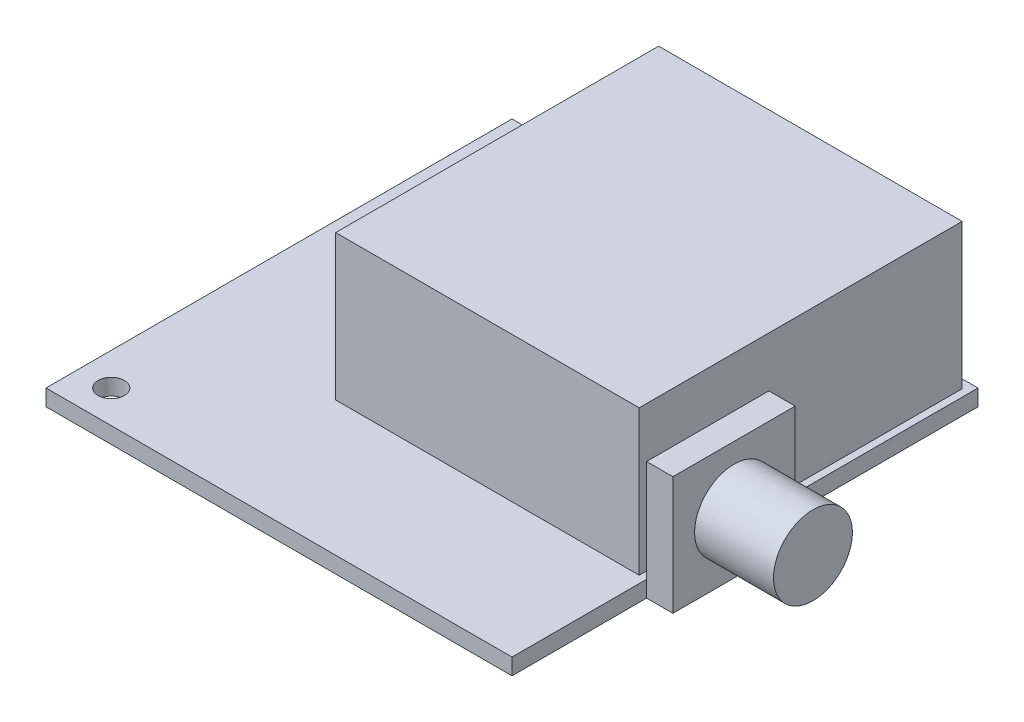
ISO-10303-21;
HEADER;
FILE_DESCRIPTION(('STEP AP214'),'2;1');
FILE_NAME('part.step','',(''),(''),'','','');
FILE_SCHEMA(('AUTOMOTIVE_DESIGN { 1 0 10303 214 1 1 1 1 }'));
ENDSEC;
DATA;
#1=APPLICATION_CONTEXT('core data for automotive mechanical design processes');
#2=APPLICATION_PROTOCOL_DEFINITION('international standard','automotive_design',2000,#1);
#3=PRODUCT_CONTEXT('',#1,'mechanical');
#4=PRODUCT('Part','Part','',(#3));
#5=PRODUCT_RELATED_PRODUCT_CATEGORY('part','',(#4));
#6=PRODUCT_DEFINITION_FORMATION('','',#4);
#7=PRODUCT_DEFINITION_CONTEXT('part definition',#1,'design');
#8=PRODUCT_DEFINITION('design','',#6,#7);
#9=PRODUCT_DEFINITION_SHAPE('','',#8);
#10=(LENGTH_UNIT() NAMED_UNIT(*) SI_UNIT(.MILLI.,.METRE.));
#11=(NAMED_UNIT(*) PLANE_ANGLE_UNIT() SI_UNIT($,.RADIAN.));
#12=(NAMED_UNIT(*) SI_UNIT($,.STERADIAN.) SOLID_ANGLE_UNIT());
#13=UNCERTAINTY_MEASURE_WITH_UNIT(LENGTH_MEASURE(1.E-05),#10,'distance_accuracy_value','');
#14=(GEOMETRIC_REPRESENTATION_CONTEXT(3) GLOBAL_UNCERTAINTY_ASSIGNED_CONTEXT((#13)) GLOBAL_UNIT_ASSIGNED_CONTEXT((#10,
#11,#12)) REPRESENTATION_CONTEXT('',''));
#15=CARTESIAN_POINT('',(0.,0.,0.));
#16=DIRECTION('',(0.,0.,1.));
#17=DIRECTION('',(1.,0.,0.));
#18=AXIS2_PLACEMENT_3D('',#15,#16,#17);
#19=CARTESIAN_POINT('',(22.5,1.5748,-22.5));
#20=DIRECTION('',(-1.,0.,0.));
#21=DIRECTION('',(0.,0.,1.));
#22=AXIS2_PLACEMENT_3D('',#19,#20,#21);
#23=PLANE('',#22);
#24=DIRECTION('',(0.,-1.,0.));
#25=VECTOR('',#24,1.);
#26=CARTESIAN_POINT('',(22.5,0.,9.50307411646456));
#27=LINE('',#26,#25);
#28=CARTESIAN_POINT('',(22.5,1.5748,9.50307411646455));
#29=VERTEX_POINT('',#28);
#30=CARTESIAN_POINT('',(22.5,0.,9.50307411646455));
#31=VERTEX_POINT('',#30);
#32=EDGE_CURVE('E49',#29,#31,#27,.T.);
#33=ORIENTED_EDGE('',*,*,#32,.F.);
#34=DIRECTION('',(0.,0.,-1.));
#35=VECTOR('',#34,1.);
#36=CARTESIAN_POINT('',(22.5,1.5748,-22.5));
#37=LINE('',#36,#35);
#38=CARTESIAN_POINT('',(22.5,1.5748,22.5));
#39=VERTEX_POINT('',#38);
#40=EDGE_CURVE('E242',#39,#29,#37,.T.);
#41=ORIENTED_EDGE('',*,*,#40,.F.);
#42=DIRECTION('',(0.,-1.,0.));
#43=VECTOR('',#42,1.);
#44=CARTESIAN_POINT('',(22.5,1.5748,22.5));
#45=LINE('',#44,#43);
#46=CARTESIAN_POINT('',(22.5,0.,22.5));
#47=VERTEX_POINT('',#46);
#48=EDGE_CURVE('E265',#39,#47,#45,.T.);
#49=ORIENTED_EDGE('',*,*,#48,.T.);
#50=DIRECTION('',(0.,0.,-1.));
#51=VECTOR('',#50,1.);
#52=CARTESIAN_POINT('',(22.5,0.,-22.5));
#53=LINE('',#52,#51);
#54=EDGE_CURVE('E255',#47,#31,#53,.T.);
#55=ORIENTED_EDGE('',*,*,#54,.T.);
#56=EDGE_LOOP('',(#33,#41,#49,#55));
#57=FACE_BOUND('',#56,.T.);
#58=ADVANCED_FACE('F40',(#57),#23,.F.);
#59=DIRECTION('',(0.,1.,0.));
#60=VECTOR('',#59,1.);
#61=CARTESIAN_POINT('',(22.5,0.,-2.30630944028398));
#62=LINE('',#61,#60);
#63=CARTESIAN_POINT('',(22.5,0.,-2.30630944028399));
#64=VERTEX_POINT('',#63);
#65=CARTESIAN_POINT('',(22.5,1.5748,-2.30630944028398));
#66=VERTEX_POINT('',#65);
#67=EDGE_CURVE('E66',#64,#66,#62,.T.);
#68=ORIENTED_EDGE('',*,*,#67,.F.);
#69=CARTESIAN_POINT('',(22.5,0.,-22.5));
#70=VERTEX_POINT('',#69);
#71=EDGE_CURVE('E254',#64,#70,#53,.T.);
#72=ORIENTED_EDGE('',*,*,#71,.T.);
#73=DIRECTION('',(0.,-1.,0.));
#74=VECTOR('',#73,1.);
#75=CARTESIAN_POINT('',(22.5,1.5748,-22.5));
#76=LINE('',#75,#74);
#77=CARTESIAN_POINT('',(22.5,1.5748,-22.5));
#78=VERTEX_POINT('',#77);
#79=EDGE_CURVE('E261',#78,#70,#76,.T.);
#80=ORIENTED_EDGE('',*,*,#79,.F.);
#81=EDGE_CURVE('E241',#66,#78,#37,.T.);
#82=ORIENTED_EDGE('',*,*,#81,.F.);
#83=EDGE_LOOP('',(#68,#72,#80,#82));
#84=FACE_BOUND('',#83,.T.);
#85=ADVANCED_FACE('F313',(#84),#23,.F.);
#86=CARTESIAN_POINT('',(0.,1.5748,0.));
#87=DIRECTION('',(0.,1.,0.));
#88=DIRECTION('',(0.,0.,1.));
#89=AXIS2_PLACEMENT_3D('',#86,#87,#88);
#90=PLANE('',#89);
#91=CARTESIAN_POINT('',(-19.3504,1.5748,-19.3504));
#92=DIRECTION('',(0.,1.,0.));
#93=DIRECTION('',(0.,0.,1.));
#94=AXIS2_PLACEMENT_3D('',#91,#92,#93);
#95=CIRCLE('',#94,1.27);
#96=CARTESIAN_POINT('',(-19.3504,1.5748,-18.0804));
#97=VERTEX_POINT('',#96);
#98=EDGE_CURVE('E228',#97,#97,#95,.T.);
#99=ORIENTED_EDGE('',*,*,#98,.F.);
#100=EDGE_LOOP('',(#99));
#101=FACE_BOUND('',#100,.T.);
#102=DIRECTION('',(0.,0.,1.));
#103=VECTOR('',#102,1.);
#104=CARTESIAN_POINT('',(-22.5,1.5748,-22.5));
#105=LINE('',#104,#103);
#106=CARTESIAN_POINT('',(-22.5,1.5748,-22.5));
#107=VERTEX_POINT('',#106);
#108=CARTESIAN_POINT('',(-22.5,1.5748,22.5));
#109=VERTEX_POINT('',#108);
#110=EDGE_CURVE('E234',#107,#109,#105,.T.);
#111=ORIENTED_EDGE('',*,*,#110,.T.);
#112=DIRECTION('',(1.,0.,0.));
#113=VECTOR('',#112,1.);
#114=CARTESIAN_POINT('',(-22.5,1.5748,22.5));
#115=LINE('',#114,#113);
#116=EDGE_CURVE('E238',#109,#39,#115,.T.);
#117=ORIENTED_EDGE('',*,*,#116,.T.);
#118=ORIENTED_EDGE('',*,*,#40,.T.);
#119=EDGE_CURVE('E245',#29,#66,#37,.T.);
#120=ORIENTED_EDGE('',*,*,#119,.T.);
#121=ORIENTED_EDGE('',*,*,#81,.T.);
#122=DIRECTION('',(-1.,0.,0.));
#123=VECTOR('',#122,1.);
#124=CARTESIAN_POINT('',(-22.5,1.5748,-22.5));
#125=LINE('',#124,#123);
#126=EDGE_CURVE('E244',#78,#107,#125,.T.);
#127=ORIENTED_EDGE('',*,*,#126,.T.);
#128=EDGE_LOOP('',(#111,#117,#118,#120,#121,#127));
#129=FACE_BOUND('',#128,.T.);
#130=CARTESIAN_POINT('',(-19.3504,1.5748,19.3504));
#131=DIRECTION('',(0.,1.,0.));
#132=DIRECTION('',(0.,0.,1.));
#133=AXIS2_PLACEMENT_3D('',#130,#131,#132);
#134=CIRCLE('',#133,1.27);
#135=CARTESIAN_POINT('',(-19.3504,1.5748,20.6204));
#136=VERTEX_POINT('',#135);
#137=EDGE_CURVE('E222',#136,#136,#134,.T.);
#138=ORIENTED_EDGE('',*,*,#137,.F.);
#139=EDGE_LOOP('',(#138));
#140=FACE_BOUND('',#139,.T.);
#141=DIRECTION('',(-1.,0.,0.));
#142=VECTOR('',#141,1.);
#143=CARTESIAN_POINT('',(21.7984716950691,1.5748,-21.6680980605292));
#144=LINE('',#143,#142);
#145=CARTESIAN_POINT('',(21.7984716950691,1.5748,-21.6680980605292));
#146=VERTEX_POINT('',#145);
#147=CARTESIAN_POINT('',(-7.5095213494975,1.5748,-21.6680980605292));
#148=VERTEX_POINT('',#147);
#149=EDGE_CURVE('E180',#146,#148,#144,.T.);
#150=ORIENTED_EDGE('',*,*,#149,.F.);
#151=DIRECTION('',(0.,0.,-1.));
#152=VECTOR('',#151,1.);
#153=CARTESIAN_POINT('',(21.7984716950691,1.5748,-21.6680980605292));
#154=LINE('',#153,#152);
#155=CARTESIAN_POINT('',(21.7984716950691,1.5748,9.51727532141174));
#156=VERTEX_POINT('',#155);
#157=EDGE_CURVE('E176',#156,#146,#154,.T.);
#158=ORIENTED_EDGE('',*,*,#157,.F.);
#159=DIRECTION('',(1.,0.,0.));
#160=VECTOR('',#159,1.);
#161=CARTESIAN_POINT('',(21.7984716950691,1.5748,9.51727532141174));
#162=LINE('',#161,#160);
#163=CARTESIAN_POINT('',(-7.50952134949749,1.5748,9.51727532141174));
#164=VERTEX_POINT('',#163);
#165=EDGE_CURVE('E192',#164,#156,#162,.T.);
#166=ORIENTED_EDGE('',*,*,#165,.F.);
#167=DIRECTION('',(0.,0.,1.));
#168=VECTOR('',#167,1.);
#169=CARTESIAN_POINT('',(-7.5095213494975,1.5748,-21.6680980605292));
#170=LINE('',#169,#168);
#171=EDGE_CURVE('E204',#148,#164,#170,.T.);
#172=ORIENTED_EDGE('',*,*,#171,.F.);
#173=EDGE_LOOP('',(#150,#158,#166,#172));
#174=FACE_BOUND('',#173,.T.);
#175=ADVANCED_FACE('F309',(#101,#129,#140,#174),#90,.T.);
#176=CARTESIAN_POINT('',(0.,0.,0.));
#177=DIRECTION('',(0.,1.,0.));
#178=DIRECTION('',(0.,0.,1.));
#179=AXIS2_PLACEMENT_3D('',#176,#177,#178);
#180=PLANE('',#179);
#181=DIRECTION('',(0.,0.,1.));
#182=VECTOR('',#181,1.);
#183=CARTESIAN_POINT('',(-22.5,0.,-22.5));
#184=LINE('',#183,#182);
#185=CARTESIAN_POINT('',(-22.5,0.,-22.5));
#186=VERTEX_POINT('',#185);
#187=CARTESIAN_POINT('',(-22.5,0.,22.5));
#188=VERTEX_POINT('',#187);
#189=EDGE_CURVE('E231',#186,#188,#184,.T.);
#190=ORIENTED_EDGE('',*,*,#189,.F.);
#191=DIRECTION('',(-1.,0.,0.));
#192=VECTOR('',#191,1.);
#193=CARTESIAN_POINT('',(-22.5,0.,-22.5));
#194=LINE('',#193,#192);
#195=EDGE_CURVE('E239',#70,#186,#194,.T.);
#196=ORIENTED_EDGE('',*,*,#195,.F.);
#197=ORIENTED_EDGE('',*,*,#71,.F.);
#198=DIRECTION('',(-1.,0.,0.));
#199=VECTOR('',#198,1.);
#200=CARTESIAN_POINT('',(25.04,0.,-2.30630944028398));
#201=LINE('',#200,#199);
#202=CARTESIAN_POINT('',(25.04,0.,-2.30630944028398));
#203=VERTEX_POINT('',#202);
#204=EDGE_CURVE('E157',#203,#64,#201,.T.);
#205=ORIENTED_EDGE('',*,*,#204,.F.);
#206=DIRECTION('',(0.,0.,-1.));
#207=VECTOR('',#206,1.);
#208=CARTESIAN_POINT('',(25.04,0.,9.50307411646456));
#209=LINE('',#208,#207);
#210=CARTESIAN_POINT('',(25.04,0.,9.50307411646456));
#211=VERTEX_POINT('',#210);
#212=EDGE_CURVE('E148',#211,#203,#209,.T.);
#213=ORIENTED_EDGE('',*,*,#212,.F.);
#214=DIRECTION('',(-1.,0.,0.));
#215=VECTOR('',#214,1.);
#216=CARTESIAN_POINT('',(25.04,0.,9.50307411646456));
#217=LINE('',#216,#215);
#218=EDGE_CURVE('E155',#211,#31,#217,.T.);
#219=ORIENTED_EDGE('',*,*,#218,.T.);
#220=ORIENTED_EDGE('',*,*,#54,.F.);
#221=DIRECTION('',(1.,0.,0.));
#222=VECTOR('',#221,1.);
#223=CARTESIAN_POINT('',(-22.5,0.,22.5));
#224=LINE('',#223,#222);
#225=EDGE_CURVE('E252',#188,#47,#224,.T.);
#226=ORIENTED_EDGE('',*,*,#225,.F.);
#227=EDGE_LOOP('',(#190,#196,#197,#205,#213,#219,#220,#226));
#228=FACE_BOUND('',#227,.T.);
#229=CARTESIAN_POINT('',(-19.3504,0.,-19.3504));
#230=DIRECTION('',(0.,1.,0.));
#231=DIRECTION('',(0.,0.,1.));
#232=AXIS2_PLACEMENT_3D('',#229,#230,#231);
#233=CIRCLE('',#232,1.27);
#234=CARTESIAN_POINT('',(-19.3504,0.,-18.0804));
#235=VERTEX_POINT('',#234);
#236=EDGE_CURVE('E225',#235,#235,#233,.T.);
#237=ORIENTED_EDGE('',*,*,#236,.T.);
#238=EDGE_LOOP('',(#237));
#239=FACE_BOUND('',#238,.T.);
#240=CARTESIAN_POINT('',(-19.3504,0.,19.3504));
#241=DIRECTION('',(0.,1.,0.));
#242=DIRECTION('',(0.,0.,1.));
#243=AXIS2_PLACEMENT_3D('',#240,#241,#242);
#244=CIRCLE('',#243,1.27);
#245=CARTESIAN_POINT('',(-19.3504,0.,20.6204));
#246=VERTEX_POINT('',#245);
#247=EDGE_CURVE('E221',#246,#246,#244,.T.);
#248=ORIENTED_EDGE('',*,*,#247,.T.);
#249=EDGE_LOOP('',(#248));
#250=FACE_BOUND('',#249,.T.);
#251=ADVANCED_FACE('F151',(#228,#239,#250),#180,.F.);
#252=CARTESIAN_POINT('',(-22.5,1.5748,-22.5));
#253=DIRECTION('',(1.,0.,0.));
#254=DIRECTION('',(0.,0.,-1.));
#255=AXIS2_PLACEMENT_3D('',#252,#253,#254);
#256=PLANE('',#255);
#257=ORIENTED_EDGE('',*,*,#189,.T.);
#258=DIRECTION('',(0.,-1.,0.));
#259=VECTOR('',#258,1.);
#260=CARTESIAN_POINT('',(-22.5,1.5748,22.5));
#261=LINE('',#260,#259);
#262=EDGE_CURVE('E267',#109,#188,#261,.T.);
#263=ORIENTED_EDGE('',*,*,#262,.F.);
#264=ORIENTED_EDGE('',*,*,#110,.F.);
#265=DIRECTION('',(0.,-1.,0.));
#266=VECTOR('',#265,1.);
#267=CARTESIAN_POINT('',(-22.5,1.5748,-22.5));
#268=LINE('',#267,#266);
#269=EDGE_CURVE('E248',#107,#186,#268,.T.);
#270=ORIENTED_EDGE('',*,*,#269,.T.);
#271=EDGE_LOOP('',(#257,#263,#264,#270));
#272=FACE_BOUND('',#271,.T.);
#273=ADVANCED_FACE('F42',(#272),#256,.F.);
#274=CARTESIAN_POINT('',(-22.5,1.5748,22.5));
#275=DIRECTION('',(0.,0.,-1.));
#276=DIRECTION('',(-1.,0.,0.));
#277=AXIS2_PLACEMENT_3D('',#274,#275,#276);
#278=PLANE('',#277);
#279=ORIENTED_EDGE('',*,*,#225,.T.);
#280=ORIENTED_EDGE('',*,*,#48,.F.);
#281=ORIENTED_EDGE('',*,*,#116,.F.);
#282=ORIENTED_EDGE('',*,*,#262,.T.);
#283=EDGE_LOOP('',(#279,#280,#281,#282));
#284=FACE_BOUND('',#283,.T.);
#285=ADVANCED_FACE('F320',(#284),#278,.F.);
#286=CARTESIAN_POINT('',(-22.5,1.5748,-22.5));
#287=DIRECTION('',(0.,0.,1.));
#288=DIRECTION('',(1.,0.,0.));
#289=AXIS2_PLACEMENT_3D('',#286,#287,#288);
#290=PLANE('',#289);
#291=ORIENTED_EDGE('',*,*,#195,.T.);
#292=ORIENTED_EDGE('',*,*,#269,.F.);
#293=ORIENTED_EDGE('',*,*,#126,.F.);
#294=ORIENTED_EDGE('',*,*,#79,.T.);
#295=EDGE_LOOP('',(#291,#292,#293,#294));
#296=FACE_BOUND('',#295,.T.);
#297=ADVANCED_FACE('F316',(#296),#290,.F.);
#298=CARTESIAN_POINT('',(-19.3504,1.5748,-19.3504));
#299=DIRECTION('',(0.,-1.,0.));
#300=DIRECTION('',(0.,0.,-1.));
#301=AXIS2_PLACEMENT_3D('',#298,#299,#300);
#302=CYLINDRICAL_SURFACE('',#301,1.27);
#303=ORIENTED_EDGE('',*,*,#98,.T.);
#304=EDGE_LOOP('',(#303));
#305=FACE_BOUND('',#304,.T.);
#306=ORIENTED_EDGE('',*,*,#236,.F.);
#307=EDGE_LOOP('',(#306));
#308=FACE_BOUND('',#307,.T.);
#309=ADVANCED_FACE('F333',(#305,#308),#302,.F.);
#310=CARTESIAN_POINT('',(-19.3504,1.5748,19.3504));
#311=DIRECTION('',(0.,-1.,0.));
#312=DIRECTION('',(0.,0.,-1.));
#313=AXIS2_PLACEMENT_3D('',#310,#311,#312);
#314=CYLINDRICAL_SURFACE('',#313,1.27);
#315=ORIENTED_EDGE('',*,*,#137,.T.);
#316=EDGE_LOOP('',(#315));
#317=FACE_BOUND('',#316,.T.);
#318=ORIENTED_EDGE('',*,*,#247,.F.);
#319=EDGE_LOOP('',(#318));
#320=FACE_BOUND('',#319,.T.);
#321=ADVANCED_FACE('F345',(#317,#320),#314,.F.);
#322=CARTESIAN_POINT('',(21.7984716950691,15.5748,-21.6680980605292));
#323=DIRECTION('',(-1.,0.,0.));
#324=DIRECTION('',(0.,0.,1.));
#325=AXIS2_PLACEMENT_3D('',#322,#323,#324);
#326=PLANE('',#325);
#327=ORIENTED_EDGE('',*,*,#157,.T.);
#328=DIRECTION('',(0.,-1.,0.));
#329=VECTOR('',#328,1.);
#330=CARTESIAN_POINT('',(21.7984716950691,15.5748,-21.6680980605292));
#331=LINE('',#330,#329);
#332=CARTESIAN_POINT('',(21.7984716950691,15.5748,-21.6680980605292));
#333=VERTEX_POINT('',#332);
#334=EDGE_CURVE('E218',#333,#146,#331,.T.);
#335=ORIENTED_EDGE('',*,*,#334,.F.);
#336=DIRECTION('',(0.,0.,-1.));
#337=VECTOR('',#336,1.);
#338=CARTESIAN_POINT('',(21.7984716950691,15.5748,-21.6680980605292));
#339=LINE('',#338,#337);
#340=CARTESIAN_POINT('',(21.7984716950691,15.5748,9.51727532141174));
#341=VERTEX_POINT('',#340);
#342=EDGE_CURVE('E187',#341,#333,#339,.T.);
#343=ORIENTED_EDGE('',*,*,#342,.F.);
#344=DIRECTION('',(0.,-1.,0.));
#345=VECTOR('',#344,1.);
#346=CARTESIAN_POINT('',(21.7984716950691,15.5748,9.51727532141174));
#347=LINE('',#346,#345);
#348=EDGE_CURVE('E200',#341,#156,#347,.T.);
#349=ORIENTED_EDGE('',*,*,#348,.T.);
#350=EDGE_LOOP('',(#327,#335,#343,#349));
#351=FACE_BOUND('',#350,.T.);
#352=ADVANCED_FACE('F349',(#351),#326,.F.);
#353=CARTESIAN_POINT('',(21.7984716950691,15.5748,-21.6680980605292));
#354=DIRECTION('',(0.,0.,1.));
#355=DIRECTION('',(1.,0.,0.));
#356=AXIS2_PLACEMENT_3D('',#353,#354,#355);
#357=PLANE('',#356);
#358=ORIENTED_EDGE('',*,*,#149,.T.);
#359=DIRECTION('',(0.,-1.,0.));
#360=VECTOR('',#359,1.);
#361=CARTESIAN_POINT('',(-7.5095213494975,15.5748,-21.6680980605292));
#362=LINE('',#361,#360);
#363=CARTESIAN_POINT('',(-7.5095213494975,15.5748,-21.6680980605292));
#364=VERTEX_POINT('',#363);
#365=EDGE_CURVE('E215',#364,#148,#362,.T.);
#366=ORIENTED_EDGE('',*,*,#365,.F.);
#367=DIRECTION('',(-1.,0.,0.));
#368=VECTOR('',#367,1.);
#369=CARTESIAN_POINT('',(21.7984716950691,15.5748,-21.6680980605292));
#370=LINE('',#369,#368);
#371=EDGE_CURVE('E191',#333,#364,#370,.T.);
#372=ORIENTED_EDGE('',*,*,#371,.F.);
#373=ORIENTED_EDGE('',*,*,#334,.T.);
#374=EDGE_LOOP('',(#358,#366,#372,#373));
#375=FACE_BOUND('',#374,.T.);
#376=ADVANCED_FACE('F353',(#375),#357,.F.);
#377=CARTESIAN_POINT('',(-7.5095213494975,15.5748,-21.6680980605292));
#378=DIRECTION('',(1.,0.,0.));
#379=DIRECTION('',(0.,0.,-1.));
#380=AXIS2_PLACEMENT_3D('',#377,#378,#379);
#381=PLANE('',#380);
#382=ORIENTED_EDGE('',*,*,#171,.T.);
#383=DIRECTION('',(0.,-1.,0.));
#384=VECTOR('',#383,1.);
#385=CARTESIAN_POINT('',(-7.50952134949749,15.5748,9.51727532141174));
#386=LINE('',#385,#384);
#387=CARTESIAN_POINT('',(-7.50952134949749,15.5748,9.51727532141174));
#388=VERTEX_POINT('',#387);
#389=EDGE_CURVE('E212',#388,#164,#386,.T.);
#390=ORIENTED_EDGE('',*,*,#389,.F.);
#391=DIRECTION('',(0.,0.,1.));
#392=VECTOR('',#391,1.);
#393=CARTESIAN_POINT('',(-7.5095213494975,15.5748,-21.6680980605292));
#394=LINE('',#393,#392);
#395=EDGE_CURVE('E195',#364,#388,#394,.T.);
#396=ORIENTED_EDGE('',*,*,#395,.F.);
#397=ORIENTED_EDGE('',*,*,#365,.T.);
#398=EDGE_LOOP('',(#382,#390,#396,#397));
#399=FACE_BOUND('',#398,.T.);
#400=ADVANCED_FACE('F357',(#399),#381,.F.);
#401=CARTESIAN_POINT('',(21.7984716950691,15.5748,9.51727532141174));
#402=DIRECTION('',(0.,0.,-1.));
#403=DIRECTION('',(-1.,0.,0.));
#404=AXIS2_PLACEMENT_3D('',#401,#402,#403);
#405=PLANE('',#404);
#406=ORIENTED_EDGE('',*,*,#165,.T.);
#407=ORIENTED_EDGE('',*,*,#348,.F.);
#408=DIRECTION('',(1.,0.,0.));
#409=VECTOR('',#408,1.);
#410=CARTESIAN_POINT('',(21.7984716950691,15.5748,9.51727532141174));
#411=LINE('',#410,#409);
#412=EDGE_CURVE('E198',#388,#341,#411,.T.);
#413=ORIENTED_EDGE('',*,*,#412,.F.);
#414=ORIENTED_EDGE('',*,*,#389,.T.);
#415=EDGE_LOOP('',(#406,#407,#413,#414));
#416=FACE_BOUND('',#415,.T.);
#417=ADVANCED_FACE('F361',(#416),#405,.F.);
#418=CARTESIAN_POINT('',(0.,15.5748,0.));
#419=DIRECTION('',(0.,-1.,0.));
#420=DIRECTION('',(0.,0.,-1.));
#421=AXIS2_PLACEMENT_3D('',#418,#419,#420);
#422=PLANE('',#421);
#423=ORIENTED_EDGE('',*,*,#342,.T.);
#424=ORIENTED_EDGE('',*,*,#371,.T.);
#425=ORIENTED_EDGE('',*,*,#395,.T.);
#426=ORIENTED_EDGE('',*,*,#412,.T.);
#427=EDGE_LOOP('',(#423,#424,#425,#426));
#428=FACE_BOUND('',#427,.T.);
#429=ADVANCED_FACE('F365',(#428),#422,.F.);
#430=CARTESIAN_POINT('',(22.5,0.,0.));
#431=DIRECTION('',(-1.,0.,0.));
#432=DIRECTION('',(0.,0.,1.));
#433=AXIS2_PLACEMENT_3D('',#430,#431,#432);
#434=PLANE('',#433);
#435=ORIENTED_EDGE('',*,*,#119,.F.);
#436=CARTESIAN_POINT('',(22.5,11.4280652418701,9.50307411646456));
#437=VERTEX_POINT('',#436);
#438=EDGE_CURVE('E272',#437,#29,#27,.T.);
#439=ORIENTED_EDGE('',*,*,#438,.F.);
#440=DIRECTION('',(0.,0.,1.));
#441=VECTOR('',#440,1.);
#442=CARTESIAN_POINT('',(22.5,11.4280652418701,9.50307411646456));
#443=LINE('',#442,#441);
#444=CARTESIAN_POINT('',(22.5,11.4280652418701,-2.30630944028398));
#445=VERTEX_POINT('',#444);
#446=EDGE_CURVE('E172',#445,#437,#443,.T.);
#447=ORIENTED_EDGE('',*,*,#446,.F.);
#448=EDGE_CURVE('E276',#66,#445,#62,.T.);
#449=ORIENTED_EDGE('',*,*,#448,.F.);
#450=EDGE_LOOP('',(#435,#439,#447,#449));
#451=FACE_BOUND('',#450,.T.);
#452=ADVANCED_FACE('F305',(#451),#434,.T.);
#453=CARTESIAN_POINT('',(25.04,0.,9.50307411646456));
#454=DIRECTION('',(0.,0.,-1.));
#455=DIRECTION('',(-1.,0.,0.));
#456=AXIS2_PLACEMENT_3D('',#453,#454,#455);
#457=PLANE('',#456);
#458=ORIENTED_EDGE('',*,*,#438,.T.);
#459=ORIENTED_EDGE('',*,*,#32,.T.);
#460=ORIENTED_EDGE('',*,*,#218,.F.);
#461=DIRECTION('',(0.,-1.,0.));
#462=VECTOR('',#461,1.);
#463=CARTESIAN_POINT('',(25.04,0.,9.50307411646456));
#464=LINE('',#463,#462);
#465=CARTESIAN_POINT('',(25.04,11.4280652418701,9.50307411646456));
#466=VERTEX_POINT('',#465);
#467=EDGE_CURVE('E162',#466,#211,#464,.T.);
#468=ORIENTED_EDGE('',*,*,#467,.F.);
#469=DIRECTION('',(-1.,0.,0.));
#470=VECTOR('',#469,1.);
#471=CARTESIAN_POINT('',(25.04,11.4280652418701,9.50307411646456));
#472=LINE('',#471,#470);
#473=EDGE_CURVE('E289',#466,#437,#472,.T.);
#474=ORIENTED_EDGE('',*,*,#473,.T.);
#475=EDGE_LOOP('',(#458,#459,#460,#468,#474));
#476=FACE_BOUND('',#475,.T.);
#477=ADVANCED_FACE('F175',(#476),#457,.F.);
#478=CARTESIAN_POINT('',(25.04,0.,-2.30630944028398));
#479=DIRECTION('',(0.,0.,1.));
#480=DIRECTION('',(1.,0.,0.));
#481=AXIS2_PLACEMENT_3D('',#478,#479,#480);
#482=PLANE('',#481);
#483=ORIENTED_EDGE('',*,*,#67,.T.);
#484=ORIENTED_EDGE('',*,*,#448,.T.);
#485=DIRECTION('',(-1.,0.,0.));
#486=VECTOR('',#485,1.);
#487=CARTESIAN_POINT('',(25.04,11.4280652418701,-2.30630944028398));
#488=LINE('',#487,#486);
#489=CARTESIAN_POINT('',(25.04,11.4280652418701,-2.30630944028398));
#490=VERTEX_POINT('',#489);
#491=EDGE_CURVE('E183',#490,#445,#488,.T.);
#492=ORIENTED_EDGE('',*,*,#491,.F.);
#493=DIRECTION('',(0.,1.,0.));
#494=VECTOR('',#493,1.);
#495=CARTESIAN_POINT('',(25.04,0.,-2.30630944028398));
#496=LINE('',#495,#494);
#497=EDGE_CURVE('E161',#203,#490,#496,.T.);
#498=ORIENTED_EDGE('',*,*,#497,.F.);
#499=ORIENTED_EDGE('',*,*,#204,.T.);
#500=EDGE_LOOP('',(#483,#484,#492,#498,#499));
#501=FACE_BOUND('',#500,.T.);
#502=ADVANCED_FACE('F297',(#501),#482,.F.);
#503=CARTESIAN_POINT('',(25.04,11.4280652418701,9.50307411646456));
#504=DIRECTION('',(0.,-1.,0.));
#505=DIRECTION('',(0.,0.,-1.));
#506=AXIS2_PLACEMENT_3D('',#503,#504,#505);
#507=PLANE('',#506);
#508=ORIENTED_EDGE('',*,*,#446,.T.);
#509=ORIENTED_EDGE('',*,*,#473,.F.);
#510=DIRECTION('',(0.,0.,1.));
#511=VECTOR('',#510,1.);
#512=CARTESIAN_POINT('',(25.04,11.4280652418701,9.50307411646456));
#513=LINE('',#512,#511);
#514=EDGE_CURVE('E167',#490,#466,#513,.T.);
#515=ORIENTED_EDGE('',*,*,#514,.F.);
#516=ORIENTED_EDGE('',*,*,#491,.T.);
#517=EDGE_LOOP('',(#508,#509,#515,#516));
#518=FACE_BOUND('',#517,.T.);
#519=ADVANCED_FACE('F302',(#518),#507,.F.);
#520=CARTESIAN_POINT('',(25.04,0.,0.));
#521=DIRECTION('',(-1.,0.,0.));
#522=DIRECTION('',(0.,0.,1.));
#523=AXIS2_PLACEMENT_3D('',#520,#521,#522);
#524=PLANE('',#523);
#525=CARTESIAN_POINT('',(25.04,5.71403262093503,3.59838233809029));
#526=DIRECTION('',(-1.,0.,0.));
#527=DIRECTION('',(0.,0.,1.));
#528=AXIS2_PLACEMENT_3D('',#525,#526,#527);
#529=CIRCLE('',#528,3.81);
#530=CARTESIAN_POINT('',(25.04,5.71403262093503,7.40838233809029));
#531=VERTEX_POINT('',#530);
#532=EDGE_CURVE('E11',#531,#531,#529,.F.);
#533=ORIENTED_EDGE('',*,*,#532,.F.);
#534=EDGE_LOOP('',(#533));
#535=FACE_BOUND('',#534,.T.);
#536=ORIENTED_EDGE('',*,*,#467,.T.);
#537=ORIENTED_EDGE('',*,*,#212,.T.);
#538=ORIENTED_EDGE('',*,*,#497,.T.);
#539=ORIENTED_EDGE('',*,*,#514,.T.);
#540=EDGE_LOOP('',(#536,#537,#538,#539));
#541=FACE_BOUND('',#540,.T.);
#542=ADVANCED_FACE('F165',(#535,#541),#524,.F.);
#543=CARTESIAN_POINT('',(32.66,5.71403262093503,3.59838233809029));
#544=DIRECTION('',(-1.,0.,0.));
#545=DIRECTION('',(0.,0.,1.));
#546=AXIS2_PLACEMENT_3D('',#543,#544,#545);
#547=CYLINDRICAL_SURFACE('',#546,3.81);
#548=CARTESIAN_POINT('',(32.66,5.71403262093503,3.59838233809029));
#549=DIRECTION('',(1.,0.,0.));
#550=DIRECTION('',(0.,0.,-1.));
#551=AXIS2_PLACEMENT_3D('',#548,#549,#550);
#552=CIRCLE('',#551,3.81);
#553=CARTESIAN_POINT('',(32.66,5.71403262093503,7.40838233809029));
#554=VERTEX_POINT('',#553);
#555=EDGE_CURVE('E277',#554,#554,#552,.T.);
#556=CARTESIAN_POINT('',(32.66,5.71403262093503,7.40838233809029));
#557=CARTESIAN_POINT('',(32.580625,5.71403262093503,7.40838233809029));
#558=CARTESIAN_POINT('',(32.50125,5.71403262093503,7.40838233809029));
#559=CARTESIAN_POINT('',(32.3425,5.71403262093503,7.40838233809029));
#560=CARTESIAN_POINT('',(32.263125,5.71403262093503,7.40838233809029));
#561=CARTESIAN_POINT('',(32.104375,5.71403262093503,7.40838233809029));
#562=CARTESIAN_POINT('',(32.025,5.71403262093503,7.40838233809029));
#563=CARTESIAN_POINT('',(31.86625,5.71403262093503,7.40838233809029));
#564=CARTESIAN_POINT('',(31.786875,5.71403262093503,7.40838233809029));
#565=CARTESIAN_POINT('',(31.628125,5.71403262093503,7.40838233809029));
#566=CARTESIAN_POINT('',(31.54875,5.71403262093503,7.40838233809029));
#567=CARTESIAN_POINT('',(31.39,5.71403262093503,7.40838233809029));
#568=CARTESIAN_POINT('',(31.310625,5.71403262093503,7.40838233809029));
#569=CARTESIAN_POINT('',(31.151875,5.71403262093503,7.40838233809029));
#570=CARTESIAN_POINT('',(31.0725,5.71403262093503,7.40838233809029));
#571=CARTESIAN_POINT('',(30.91375,5.71403262093503,7.40838233809029));
#572=CARTESIAN_POINT('',(30.834375,5.71403262093503,7.40838233809029));
#573=CARTESIAN_POINT('',(30.675625,5.71403262093503,7.40838233809029));
#574=CARTESIAN_POINT('',(30.59625,5.71403262093503,7.40838233809029));
#575=CARTESIAN_POINT('',(30.4375,5.71403262093503,7.40838233809029));
#576=CARTESIAN_POINT('',(30.358125,5.71403262093503,7.40838233809029));
#577=CARTESIAN_POINT('',(30.199375,5.71403262093503,7.40838233809029));
#578=CARTESIAN_POINT('',(30.12,5.71403262093503,7.40838233809029));
#579=CARTESIAN_POINT('',(29.96125,5.71403262093503,7.40838233809029));
#580=CARTESIAN_POINT('',(29.881875,5.71403262093503,7.40838233809029));
#581=CARTESIAN_POINT('',(29.723125,5.71403262093503,7.40838233809029));
#582=CARTESIAN_POINT('',(29.64375,5.71403262093503,7.40838233809029));
#583=CARTESIAN_POINT('',(29.485,5.71403262093503,7.40838233809029));
#584=CARTESIAN_POINT('',(29.405625,5.71403262093503,7.40838233809029));
#585=CARTESIAN_POINT('',(29.246875,5.71403262093503,7.40838233809029));
#586=CARTESIAN_POINT('',(29.1675,5.71403262093503,7.40838233809029));
#587=CARTESIAN_POINT('',(29.00875,5.71403262093503,7.40838233809029));
#588=CARTESIAN_POINT('',(28.929375,5.71403262093503,7.40838233809029));
#589=CARTESIAN_POINT('',(28.770625,5.71403262093503,7.40838233809029));
#590=CARTESIAN_POINT('',(28.69125,5.71403262093503,7.40838233809029));
#591=CARTESIAN_POINT('',(28.5325,5.71403262093503,7.40838233809029));
#592=CARTESIAN_POINT('',(28.453125,5.71403262093503,7.40838233809029));
#593=CARTESIAN_POINT('',(28.294375,5.71403262093503,7.40838233809029));
#594=CARTESIAN_POINT('',(28.215,5.71403262093503,7.40838233809029));
#595=CARTESIAN_POINT('',(28.05625,5.71403262093503,7.40838233809029));
#596=CARTESIAN_POINT('',(27.976875,5.71403262093503,7.40838233809029));
#597=CARTESIAN_POINT('',(27.818125,5.71403262093503,7.40838233809029));
#598=CARTESIAN_POINT('',(27.73875,5.71403262093503,7.40838233809029));
#599=CARTESIAN_POINT('',(27.58,5.71403262093503,7.40838233809029));
#600=CARTESIAN_POINT('',(27.500625,5.71403262093503,7.40838233809029));
#601=CARTESIAN_POINT('',(27.341875,5.71403262093503,7.40838233809029));
#602=CARTESIAN_POINT('',(27.2625,5.71403262093503,7.40838233809029));
#603=CARTESIAN_POINT('',(27.10375,5.71403262093503,7.40838233809029));
#604=CARTESIAN_POINT('',(27.024375,5.71403262093503,7.40838233809029));
#605=CARTESIAN_POINT('',(26.865625,5.71403262093503,7.40838233809029));
#606=CARTESIAN_POINT('',(26.78625,5.71403262093503,7.40838233809029));
#607=CARTESIAN_POINT('',(26.6275,5.71403262093503,7.40838233809029));
#608=CARTESIAN_POINT('',(26.548125,5.71403262093503,7.40838233809029));
#609=CARTESIAN_POINT('',(26.389375,5.71403262093503,7.40838233809029));
#610=CARTESIAN_POINT('',(26.31,5.71403262093503,7.40838233809029));
#611=CARTESIAN_POINT('',(26.15125,5.71403262093503,7.40838233809029));
#612=CARTESIAN_POINT('',(26.071875,5.71403262093503,7.40838233809029));
#613=CARTESIAN_POINT('',(25.913125,5.71403262093503,7.40838233809029));
#614=CARTESIAN_POINT('',(25.83375,5.71403262093503,7.40838233809029));
#615=CARTESIAN_POINT('',(25.675,5.71403262093503,7.40838233809029));
#616=CARTESIAN_POINT('',(25.595625,5.71403262093503,7.40838233809029));
#617=CARTESIAN_POINT('',(25.436875,5.71403262093503,7.40838233809029));
#618=CARTESIAN_POINT('',(25.3575,5.71403262093503,7.40838233809029));
#619=CARTESIAN_POINT('',(25.19875,5.71403262093503,7.40838233809029));
#620=CARTESIAN_POINT('',(25.119375,5.71403262093503,7.40838233809029));
#621=CARTESIAN_POINT('',(25.04,5.71403262093503,7.40838233809029));
#622=B_SPLINE_CURVE_WITH_KNOTS('',3,(#556,#557,#558,#559,#560,#561,#562,#563,#564,#565,#566,
#567,#568,#569,#570,#571,#572,#573,#574,#575,#576,#577,#578,#579,#580,#581,#582,#583,#584,#585,
#586,#587,#588,#589,#590,#591,#592,#593,#594,#595,#596,#597,#598,#599,#600,#601,#602,#603,#604,
#605,#606,#607,#608,#609,#610,#611,#612,#613,#614,#615,#616,#617,#618,#619,#620,#621),
.UNSPECIFIED.,.F.,.F.,(4,2,2,2,2,2,2,2,2,2,2,2,2,2,2,2,2,2,2,2,2,2,2,2,2,2,2,2,2,2,2,2,4),(0.,
0.238124999999999,0.476249999999998,0.714374999999996,0.952499999999995,1.19062499999999,
1.42875,1.66687499999999,1.90499999999999,2.143125,2.38124999999999,2.61937499999999,2.8575,
3.09562499999999,3.33374999999999,3.571875,3.80999999999999,4.04812499999999,4.28624999999999,
4.52437499999999,4.76249999999999,5.00062499999999,5.23874999999999,5.47687499999999,
5.71499999999999,5.95312499999999,6.19124999999999,6.42937499999999,6.66749999999999,
6.90562499999999,7.14374999999999,7.38187499999999,7.61999999999999),.UNSPECIFIED.);
#623=EDGE_CURVE('BSEAM380',#554,#531,#622,.T.);
#624=ORIENTED_EDGE('',*,*,#555,.F.);
#625=ORIENTED_EDGE('',*,*,#532,.T.);
#626=ORIENTED_EDGE('',*,*,#623,.T.);
#627=ORIENTED_EDGE('',*,*,#623,.F.);
#628=EDGE_LOOP('',(#624,#626,#625,#627));
#629=FACE_BOUND('',#628,.T.);
#630=ADVANCED_FACE('F380',(#629),#547,.T.);
#631=CARTESIAN_POINT('',(32.66,5.71403262093503,3.59838233809029));
#632=DIRECTION('',(1.,0.,0.));
#633=DIRECTION('',(0.,0.,-1.));
#634=AXIS2_PLACEMENT_3D('',#631,#632,#633);
#635=PLANE('',#634);
#636=ORIENTED_EDGE('',*,*,#555,.T.);
#637=EDGE_LOOP('',(#636));
#638=FACE_BOUND('',#637,.T.);
#639=ADVANCED_FACE('F384',(#638),#635,.T.);
#640=CLOSED_SHELL('',(#58,#85,#175,#251,#273,#285,#297,#309,#321,#352,#376,#400,#417,#429,#452,
#477,#502,#519,#542,#630,#639));
#641=MANIFOLD_SOLID_BREP('B2',#640);
#642=ADVANCED_BREP_SHAPE_REPRESENTATION('',(#18,#641),#14);
#643=SHAPE_DEFINITION_REPRESENTATION(#9,#642);
ENDSEC;
END-ISO-10303-21;
